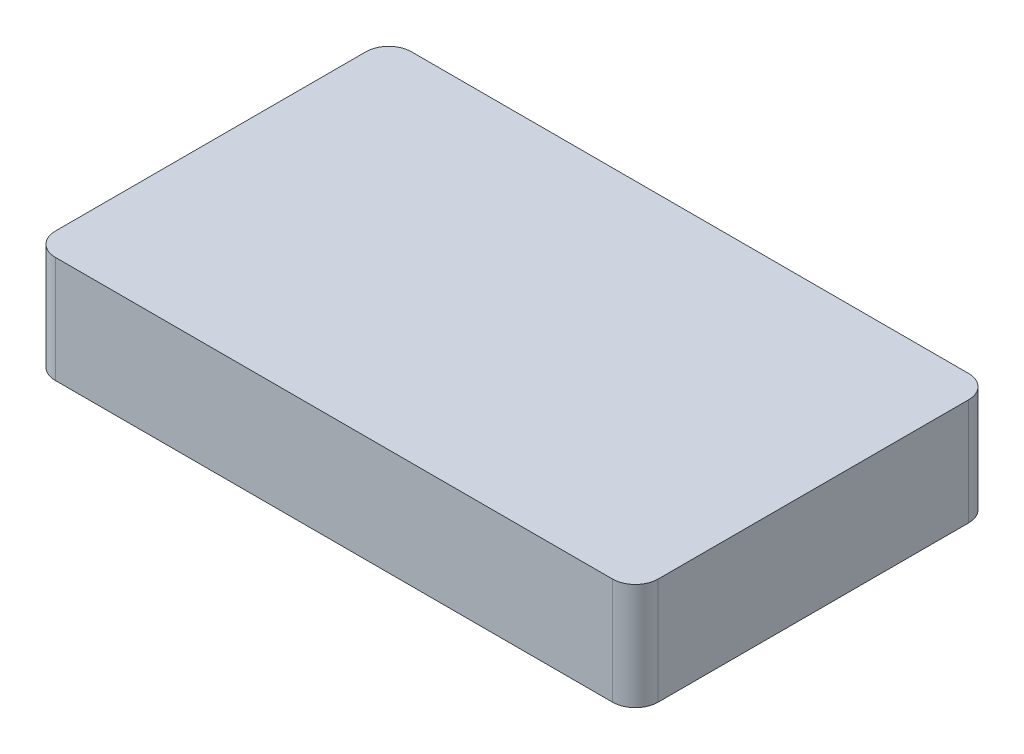
ISO-10303-21;
HEADER;
FILE_DESCRIPTION(('STEP AP214'),'2;1');
FILE_NAME('part.step','',(''),(''),'','','');
FILE_SCHEMA(('AUTOMOTIVE_DESIGN { 1 0 10303 214 1 1 1 1 }'));
ENDSEC;
DATA;
#1=APPLICATION_CONTEXT('core data for automotive mechanical design processes');
#2=APPLICATION_PROTOCOL_DEFINITION('international standard','automotive_design',2000,#1);
#3=PRODUCT_CONTEXT('',#1,'mechanical');
#4=PRODUCT('Part','Part','',(#3));
#5=PRODUCT_RELATED_PRODUCT_CATEGORY('part','',(#4));
#6=PRODUCT_DEFINITION_FORMATION('','',#4);
#7=PRODUCT_DEFINITION_CONTEXT('part definition',#1,'design');
#8=PRODUCT_DEFINITION('design','',#6,#7);
#9=PRODUCT_DEFINITION_SHAPE('','',#8);
#10=(LENGTH_UNIT() NAMED_UNIT(*) SI_UNIT(.MILLI.,.METRE.));
#11=(NAMED_UNIT(*) PLANE_ANGLE_UNIT() SI_UNIT($,.RADIAN.));
#12=(NAMED_UNIT(*) SI_UNIT($,.STERADIAN.) SOLID_ANGLE_UNIT());
#13=UNCERTAINTY_MEASURE_WITH_UNIT(LENGTH_MEASURE(1.E-05),#10,'distance_accuracy_value','');
#14=(GEOMETRIC_REPRESENTATION_CONTEXT(3) GLOBAL_UNCERTAINTY_ASSIGNED_CONTEXT((#13)) GLOBAL_UNIT_ASSIGNED_CONTEXT((#10,
#11,#12)) REPRESENTATION_CONTEXT('',''));
#15=CARTESIAN_POINT('',(0.,0.,0.));
#16=DIRECTION('',(0.,0.,1.));
#17=DIRECTION('',(1.,0.,0.));
#18=AXIS2_PLACEMENT_3D('',#15,#16,#17);
#19=CARTESIAN_POINT('',(127.2,23.4,-5.00000000000002));
#20=DIRECTION('',(0.,-1.,0.));
#21=DIRECTION('',(0.,0.,-1.));
#22=AXIS2_PLACEMENT_3D('',#19,#20,#21);
#23=CYLINDRICAL_SURFACE('',#22,5.00000000000001);
#24=CARTESIAN_POINT('',(127.2,0.,-5.00000000000002));
#25=DIRECTION('',(0.,1.,0.));
#26=DIRECTION('',(0.,0.,1.));
#27=AXIS2_PLACEMENT_3D('',#24,#25,#26);
#28=CIRCLE('',#27,5.00000000000001);
#29=CARTESIAN_POINT('',(127.2,0.,0.));
#30=VERTEX_POINT('',#29);
#31=CARTESIAN_POINT('',(132.2,0.,-5.00000000000002));
#32=VERTEX_POINT('',#31);
#33=EDGE_CURVE('E140',#30,#32,#28,.T.);
#34=ORIENTED_EDGE('',*,*,#33,.T.);
#35=DIRECTION('',(0.,-1.,0.));
#36=VECTOR('',#35,1.);
#37=CARTESIAN_POINT('',(132.2,23.4,-5.00000000000002));
#38=LINE('',#37,#36);
#39=CARTESIAN_POINT('',(132.2,23.4,-5.00000000000002));
#40=VERTEX_POINT('',#39);
#41=EDGE_CURVE('E11',#40,#32,#38,.T.);
#42=ORIENTED_EDGE('',*,*,#41,.F.);
#43=CARTESIAN_POINT('',(127.2,23.4,-5.00000000000002));
#44=DIRECTION('',(0.,1.,0.));
#45=DIRECTION('',(0.,0.,1.));
#46=AXIS2_PLACEMENT_3D('',#43,#44,#45);
#47=CIRCLE('',#46,5.00000000000001);
#48=CARTESIAN_POINT('',(127.2,23.4,0.));
#49=VERTEX_POINT('',#48);
#50=EDGE_CURVE('E162',#49,#40,#47,.T.);
#51=ORIENTED_EDGE('',*,*,#50,.F.);
#52=DIRECTION('',(0.,-1.,0.));
#53=VECTOR('',#52,1.);
#54=CARTESIAN_POINT('',(127.2,23.4,0.));
#55=LINE('',#54,#53);
#56=EDGE_CURVE('E136',#49,#30,#55,.T.);
#57=ORIENTED_EDGE('',*,*,#56,.T.);
#58=EDGE_LOOP('',(#34,#42,#51,#57));
#59=FACE_BOUND('',#58,.T.);
#60=ADVANCED_FACE('F39',(#59),#23,.T.);
#61=CARTESIAN_POINT('',(132.2,23.4,-5.00000000000002));
#62=DIRECTION('',(-1.,0.,0.));
#63=DIRECTION('',(0.,0.,1.));
#64=AXIS2_PLACEMENT_3D('',#61,#62,#63);
#65=PLANE('',#64);
#66=DIRECTION('',(0.,0.,-1.));
#67=VECTOR('',#66,1.);
#68=CARTESIAN_POINT('',(132.2,0.,-5.00000000000002));
#69=LINE('',#68,#67);
#70=CARTESIAN_POINT('',(132.2,0.,-73.1));
#71=VERTEX_POINT('',#70);
#72=EDGE_CURVE('E144',#32,#71,#69,.T.);
#73=ORIENTED_EDGE('',*,*,#72,.T.);
#74=DIRECTION('',(0.,-1.,0.));
#75=VECTOR('',#74,1.);
#76=CARTESIAN_POINT('',(132.2,23.4,-73.1));
#77=LINE('',#76,#75);
#78=CARTESIAN_POINT('',(132.2,23.4,-73.1));
#79=VERTEX_POINT('',#78);
#80=EDGE_CURVE('E48',#79,#71,#77,.T.);
#81=ORIENTED_EDGE('',*,*,#80,.F.);
#82=DIRECTION('',(0.,0.,-1.));
#83=VECTOR('',#82,1.);
#84=CARTESIAN_POINT('',(132.2,23.4,-5.00000000000002));
#85=LINE('',#84,#83);
#86=EDGE_CURVE('E99',#40,#79,#85,.T.);
#87=ORIENTED_EDGE('',*,*,#86,.F.);
#88=ORIENTED_EDGE('',*,*,#41,.T.);
#89=EDGE_LOOP('',(#73,#81,#87,#88));
#90=FACE_BOUND('',#89,.T.);
#91=ADVANCED_FACE('F208',(#90),#65,.F.);
#92=CARTESIAN_POINT('',(127.2,23.4,-73.1));
#93=DIRECTION('',(0.,-1.,0.));
#94=DIRECTION('',(0.,0.,-1.));
#95=AXIS2_PLACEMENT_3D('',#92,#93,#94);
#96=CYLINDRICAL_SURFACE('',#95,5.);
#97=CARTESIAN_POINT('',(127.2,0.,-73.1));
#98=DIRECTION('',(0.,1.,0.));
#99=DIRECTION('',(0.,0.,-1.));
#100=AXIS2_PLACEMENT_3D('',#97,#98,#99);
#101=CIRCLE('',#100,5.);
#102=CARTESIAN_POINT('',(127.2,0.,-78.1));
#103=VERTEX_POINT('',#102);
#104=EDGE_CURVE('E147',#71,#103,#101,.T.);
#105=ORIENTED_EDGE('',*,*,#104,.T.);
#106=DIRECTION('',(0.,-1.,0.));
#107=VECTOR('',#106,1.);
#108=CARTESIAN_POINT('',(127.2,23.4,-78.1));
#109=LINE('',#108,#107);
#110=CARTESIAN_POINT('',(127.2,23.4,-78.1));
#111=VERTEX_POINT('',#110);
#112=EDGE_CURVE('E173',#111,#103,#109,.T.);
#113=ORIENTED_EDGE('',*,*,#112,.F.);
#114=CARTESIAN_POINT('',(127.2,23.4,-73.1));
#115=DIRECTION('',(0.,1.,0.));
#116=DIRECTION('',(0.,0.,-1.));
#117=AXIS2_PLACEMENT_3D('',#114,#115,#116);
#118=CIRCLE('',#117,5.);
#119=EDGE_CURVE('E183',#79,#111,#118,.T.);
#120=ORIENTED_EDGE('',*,*,#119,.F.);
#121=ORIENTED_EDGE('',*,*,#80,.T.);
#122=EDGE_LOOP('',(#105,#113,#120,#121));
#123=FACE_BOUND('',#122,.T.);
#124=ADVANCED_FACE('F181',(#123),#96,.T.);
#125=CARTESIAN_POINT('',(4.99999999999999,23.4,-78.1));
#126=DIRECTION('',(0.,0.,1.));
#127=DIRECTION('',(1.,0.,0.));
#128=AXIS2_PLACEMENT_3D('',#125,#126,#127);
#129=PLANE('',#128);
#130=DIRECTION('',(-1.,0.,0.));
#131=VECTOR('',#130,1.);
#132=CARTESIAN_POINT('',(4.99999999999999,0.,-78.1));
#133=LINE('',#132,#131);
#134=CARTESIAN_POINT('',(4.99999999999999,0.,-78.1));
#135=VERTEX_POINT('',#134);
#136=EDGE_CURVE('E150',#103,#135,#133,.T.);
#137=ORIENTED_EDGE('',*,*,#136,.T.);
#138=DIRECTION('',(0.,-1.,0.));
#139=VECTOR('',#138,1.);
#140=CARTESIAN_POINT('',(4.99999999999999,23.4,-78.1));
#141=LINE('',#140,#139);
#142=CARTESIAN_POINT('',(4.99999999999999,23.4,-78.1));
#143=VERTEX_POINT('',#142);
#144=EDGE_CURVE('E169',#143,#135,#141,.T.);
#145=ORIENTED_EDGE('',*,*,#144,.F.);
#146=DIRECTION('',(-1.,0.,0.));
#147=VECTOR('',#146,1.);
#148=CARTESIAN_POINT('',(4.99999999999999,23.4,-78.1));
#149=LINE('',#148,#147);
#150=EDGE_CURVE('E196',#111,#143,#149,.T.);
#151=ORIENTED_EDGE('',*,*,#150,.F.);
#152=ORIENTED_EDGE('',*,*,#112,.T.);
#153=EDGE_LOOP('',(#137,#145,#151,#152));
#154=FACE_BOUND('',#153,.T.);
#155=ADVANCED_FACE('F191',(#154),#129,.F.);
#156=CARTESIAN_POINT('',(4.99999999999999,23.4,-73.1));
#157=DIRECTION('',(0.,-1.,0.));
#158=DIRECTION('',(0.,0.,-1.));
#159=AXIS2_PLACEMENT_3D('',#156,#157,#158);
#160=CYLINDRICAL_SURFACE('',#159,5.);
#161=CARTESIAN_POINT('',(4.99999999999999,0.,-73.1));
#162=DIRECTION('',(0.,1.,0.));
#163=DIRECTION('',(0.,0.,-1.));
#164=AXIS2_PLACEMENT_3D('',#161,#162,#163);
#165=CIRCLE('',#164,5.);
#166=CARTESIAN_POINT('',(0.,0.,-73.1));
#167=VERTEX_POINT('',#166);
#168=EDGE_CURVE('E153',#135,#167,#165,.T.);
#169=ORIENTED_EDGE('',*,*,#168,.T.);
#170=DIRECTION('',(0.,-1.,0.));
#171=VECTOR('',#170,1.);
#172=CARTESIAN_POINT('',(0.,23.4,-73.1));
#173=LINE('',#172,#171);
#174=CARTESIAN_POINT('',(0.,23.4,-73.1));
#175=VERTEX_POINT('',#174);
#176=EDGE_CURVE('E129',#175,#167,#173,.T.);
#177=ORIENTED_EDGE('',*,*,#176,.F.);
#178=CARTESIAN_POINT('',(4.99999999999999,23.4,-73.1));
#179=DIRECTION('',(0.,1.,0.));
#180=DIRECTION('',(0.,0.,-1.));
#181=AXIS2_PLACEMENT_3D('',#178,#179,#180);
#182=CIRCLE('',#181,5.);
#183=EDGE_CURVE('E118',#143,#175,#182,.T.);
#184=ORIENTED_EDGE('',*,*,#183,.F.);
#185=ORIENTED_EDGE('',*,*,#144,.T.);
#186=EDGE_LOOP('',(#169,#177,#184,#185));
#187=FACE_BOUND('',#186,.T.);
#188=ADVANCED_FACE('F194',(#187),#160,.T.);
#189=CARTESIAN_POINT('',(0.,23.4,-5.00000000000004));
#190=DIRECTION('',(1.,0.,0.));
#191=DIRECTION('',(0.,0.,-1.));
#192=AXIS2_PLACEMENT_3D('',#189,#190,#191);
#193=PLANE('',#192);
#194=DIRECTION('',(0.,0.,1.));
#195=VECTOR('',#194,1.);
#196=CARTESIAN_POINT('',(0.,0.,-5.00000000000004));
#197=LINE('',#196,#195);
#198=CARTESIAN_POINT('',(0.,0.,-5.00000000000003));
#199=VERTEX_POINT('',#198);
#200=EDGE_CURVE('E127',#167,#199,#197,.T.);
#201=ORIENTED_EDGE('',*,*,#200,.T.);
#202=DIRECTION('',(0.,-1.,0.));
#203=VECTOR('',#202,1.);
#204=CARTESIAN_POINT('',(0.,23.4,-5.00000000000003));
#205=LINE('',#204,#203);
#206=CARTESIAN_POINT('',(0.,23.4,-5.00000000000003));
#207=VERTEX_POINT('',#206);
#208=EDGE_CURVE('E124',#207,#199,#205,.T.);
#209=ORIENTED_EDGE('',*,*,#208,.F.);
#210=DIRECTION('',(0.,0.,1.));
#211=VECTOR('',#210,1.);
#212=CARTESIAN_POINT('',(0.,23.4,-5.00000000000004));
#213=LINE('',#212,#211);
#214=EDGE_CURVE('E112',#175,#207,#213,.T.);
#215=ORIENTED_EDGE('',*,*,#214,.F.);
#216=ORIENTED_EDGE('',*,*,#176,.T.);
#217=EDGE_LOOP('',(#201,#209,#215,#216));
#218=FACE_BOUND('',#217,.T.);
#219=ADVANCED_FACE('F125',(#218),#193,.F.);
#220=CARTESIAN_POINT('',(5.,23.4,-5.));
#221=DIRECTION('',(0.,-1.,0.));
#222=DIRECTION('',(0.,0.,-1.));
#223=AXIS2_PLACEMENT_3D('',#220,#221,#222);
#224=CYLINDRICAL_SURFACE('',#223,5.);
#225=CARTESIAN_POINT('',(5.,0.,-5.));
#226=DIRECTION('',(0.,1.,0.));
#227=DIRECTION('',(0.,0.,-1.));
#228=AXIS2_PLACEMENT_3D('',#225,#226,#227);
#229=CIRCLE('',#228,5.);
#230=CARTESIAN_POINT('',(5.00000000000004,0.,0.));
#231=VERTEX_POINT('',#230);
#232=EDGE_CURVE('E85',#199,#231,#229,.T.);
#233=ORIENTED_EDGE('',*,*,#232,.T.);
#234=DIRECTION('',(0.,-1.,0.));
#235=VECTOR('',#234,1.);
#236=CARTESIAN_POINT('',(5.00000000000004,23.4,0.));
#237=LINE('',#236,#235);
#238=CARTESIAN_POINT('',(5.00000000000004,23.4,0.));
#239=VERTEX_POINT('',#238);
#240=EDGE_CURVE('E130',#239,#231,#237,.T.);
#241=ORIENTED_EDGE('',*,*,#240,.F.);
#242=CARTESIAN_POINT('',(5.,23.4,-5.));
#243=DIRECTION('',(0.,1.,0.));
#244=DIRECTION('',(0.,0.,-1.));
#245=AXIS2_PLACEMENT_3D('',#242,#243,#244);
#246=CIRCLE('',#245,5.);
#247=EDGE_CURVE('E116',#207,#239,#246,.T.);
#248=ORIENTED_EDGE('',*,*,#247,.F.);
#249=ORIENTED_EDGE('',*,*,#208,.T.);
#250=EDGE_LOOP('',(#233,#241,#248,#249));
#251=FACE_BOUND('',#250,.T.);
#252=ADVANCED_FACE('F132',(#251),#224,.T.);
#253=CARTESIAN_POINT('',(5.00000000000004,23.4,0.));
#254=DIRECTION('',(0.,0.,-1.));
#255=DIRECTION('',(-1.,0.,0.));
#256=AXIS2_PLACEMENT_3D('',#253,#254,#255);
#257=PLANE('',#256);
#258=DIRECTION('',(1.,0.,0.));
#259=VECTOR('',#258,1.);
#260=CARTESIAN_POINT('',(5.00000000000004,0.,0.));
#261=LINE('',#260,#259);
#262=EDGE_CURVE('E91',#231,#30,#261,.T.);
#263=ORIENTED_EDGE('',*,*,#262,.T.);
#264=ORIENTED_EDGE('',*,*,#56,.F.);
#265=DIRECTION('',(1.,0.,0.));
#266=VECTOR('',#265,1.);
#267=CARTESIAN_POINT('',(5.00000000000004,23.4,0.));
#268=LINE('',#267,#266);
#269=EDGE_CURVE('E56',#239,#49,#268,.T.);
#270=ORIENTED_EDGE('',*,*,#269,.F.);
#271=ORIENTED_EDGE('',*,*,#240,.T.);
#272=EDGE_LOOP('',(#263,#264,#270,#271));
#273=FACE_BOUND('',#272,.T.);
#274=ADVANCED_FACE('F224',(#273),#257,.F.);
#275=CARTESIAN_POINT('',(127.2,23.4,-5.00000000000002));
#276=DIRECTION('',(0.,1.,0.));
#277=DIRECTION('',(0.,0.,1.));
#278=AXIS2_PLACEMENT_3D('',#275,#276,#277);
#279=PLANE('',#278);
#280=ORIENTED_EDGE('',*,*,#50,.T.);
#281=ORIENTED_EDGE('',*,*,#86,.T.);
#282=ORIENTED_EDGE('',*,*,#119,.T.);
#283=ORIENTED_EDGE('',*,*,#150,.T.);
#284=ORIENTED_EDGE('',*,*,#183,.T.);
#285=ORIENTED_EDGE('',*,*,#214,.T.);
#286=ORIENTED_EDGE('',*,*,#247,.T.);
#287=ORIENTED_EDGE('',*,*,#269,.T.);
#288=EDGE_LOOP('',(#280,#281,#282,#283,#284,#285,#286,#287));
#289=FACE_BOUND('',#288,.T.);
#290=ADVANCED_FACE('F114',(#289),#279,.T.);
#291=CARTESIAN_POINT('',(127.2,0.,-5.00000000000002));
#292=DIRECTION('',(0.,1.,0.));
#293=DIRECTION('',(0.,0.,1.));
#294=AXIS2_PLACEMENT_3D('',#291,#292,#293);
#295=PLANE('',#294);
#296=ORIENTED_EDGE('',*,*,#33,.F.);
#297=ORIENTED_EDGE('',*,*,#262,.F.);
#298=ORIENTED_EDGE('',*,*,#232,.F.);
#299=ORIENTED_EDGE('',*,*,#200,.F.);
#300=ORIENTED_EDGE('',*,*,#168,.F.);
#301=ORIENTED_EDGE('',*,*,#136,.F.);
#302=ORIENTED_EDGE('',*,*,#104,.F.);
#303=ORIENTED_EDGE('',*,*,#72,.F.);
#304=EDGE_LOOP('',(#296,#297,#298,#299,#300,#301,#302,#303));
#305=FACE_BOUND('',#304,.T.);
#306=ADVANCED_FACE('F187',(#305),#295,.F.);
#307=CLOSED_SHELL('',(#60,#91,#124,#155,#188,#219,#252,#274,#290,#306));
#308=MANIFOLD_SOLID_BREP('B2',#307);
#309=ADVANCED_BREP_SHAPE_REPRESENTATION('',(#18,#308),#14);
#310=SHAPE_DEFINITION_REPRESENTATION(#9,#309);
ENDSEC;
END-ISO-10303-21;
